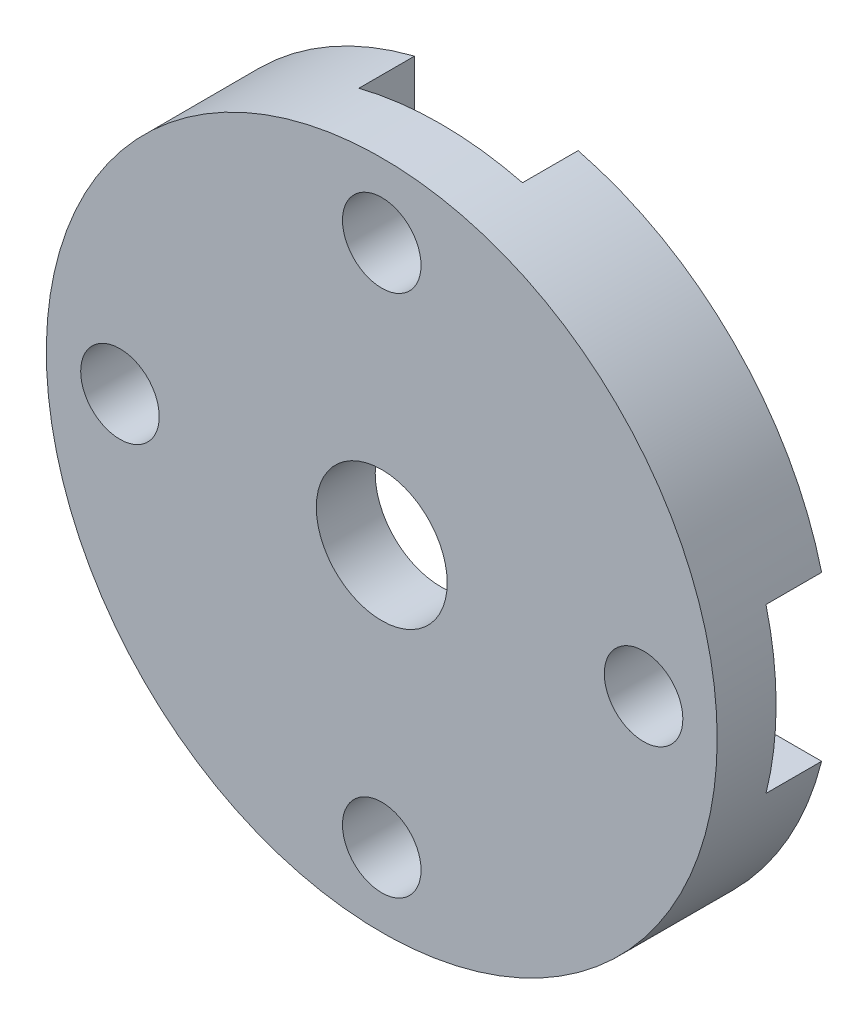
ISO-10303-21;
HEADER;
FILE_DESCRIPTION(('STEP AP214'),'2;1');
FILE_NAME('part.step','',(''),(''),'','','');
FILE_SCHEMA(('AUTOMOTIVE_DESIGN { 1 0 10303 214 1 1 1 1 }'));
ENDSEC;
DATA;
#1=APPLICATION_CONTEXT('core data for automotive mechanical design processes');
#2=APPLICATION_PROTOCOL_DEFINITION('international standard','automotive_design',2000,#1);
#3=PRODUCT_CONTEXT('',#1,'mechanical');
#4=PRODUCT('Part','Part','',(#3));
#5=PRODUCT_RELATED_PRODUCT_CATEGORY('part','',(#4));
#6=PRODUCT_DEFINITION_FORMATION('','',#4);
#7=PRODUCT_DEFINITION_CONTEXT('part definition',#1,'design');
#8=PRODUCT_DEFINITION('design','',#6,#7);
#9=PRODUCT_DEFINITION_SHAPE('','',#8);
#10=(LENGTH_UNIT() NAMED_UNIT(*) SI_UNIT(.MILLI.,.METRE.));
#11=(NAMED_UNIT(*) PLANE_ANGLE_UNIT() SI_UNIT($,.RADIAN.));
#12=(NAMED_UNIT(*) SI_UNIT($,.STERADIAN.) SOLID_ANGLE_UNIT());
#13=UNCERTAINTY_MEASURE_WITH_UNIT(LENGTH_MEASURE(1.E-05),#10,'distance_accuracy_value','');
#14=(GEOMETRIC_REPRESENTATION_CONTEXT(3) GLOBAL_UNCERTAINTY_ASSIGNED_CONTEXT((#13)) GLOBAL_UNIT_ASSIGNED_CONTEXT((#10,
#11,#12)) REPRESENTATION_CONTEXT('',''));
#15=CARTESIAN_POINT('',(0.,0.,0.));
#16=DIRECTION('',(0.,0.,1.));
#17=DIRECTION('',(1.,0.,0.));
#18=AXIS2_PLACEMENT_3D('',#15,#16,#17);
#19=CARTESIAN_POINT('',(0.,0.,0.));
#20=DIRECTION('',(0.,0.,1.));
#21=DIRECTION('',(1.,0.,0.));
#22=AXIS2_PLACEMENT_3D('',#19,#20,#21);
#23=PLANE('',#22);
#24=CARTESIAN_POINT('',(7.999,-0.000999999999916204,0.));
#25=DIRECTION('',(0.,0.,-1.));
#26=DIRECTION('',(-1.,0.,0.));
#27=AXIS2_PLACEMENT_3D('',#24,#25,#26);
#28=CIRCLE('',#27,2.5);
#29=CARTESIAN_POINT('',(8.00099999935998,2.49899920000043,0.));
#30=VERTEX_POINT('',#29);
#31=CARTESIAN_POINT('',(7.60963489096445,2.46849282482581,0.));
#32=VERTEX_POINT('',#31);
#33=EDGE_CURVE('E414',#30,#32,#28,.F.);
#34=ORIENTED_EDGE('',*,*,#33,.T.);
#35=CARTESIAN_POINT('',(0.,0.,0.));
#36=DIRECTION('',(0.,0.,-1.));
#37=DIRECTION('',(-1.,0.,0.));
#38=AXIS2_PLACEMENT_3D('',#35,#36,#37);
#39=CIRCLE('',#38,8.);
#40=CARTESIAN_POINT('',(2.46929384832486,7.609375,0.));
#41=VERTEX_POINT('',#40);
#42=EDGE_CURVE('E597',#41,#32,#39,.T.);
#43=ORIENTED_EDGE('',*,*,#42,.F.);
#44=CARTESIAN_POINT('',(0.,8.,0.));
#45=DIRECTION('',(0.,0.,-1.));
#46=DIRECTION('',(-1.,0.,0.));
#47=AXIS2_PLACEMENT_3D('',#44,#45,#46);
#48=CIRCLE('',#47,2.5);
#49=CARTESIAN_POINT('',(2.5,8.,0.));
#50=VERTEX_POINT('',#49);
#51=EDGE_CURVE('E430',#41,#50,#48,.F.);
#52=ORIENTED_EDGE('',*,*,#51,.T.);
#53=DIRECTION('',(0.,1.,0.));
#54=VECTOR('',#53,1.);
#55=CARTESIAN_POINT('',(2.5,0.,0.));
#56=LINE('',#55,#54);
#57=CARTESIAN_POINT('',(2.5,9.94044767603552,0.));
#58=VERTEX_POINT('',#57);
#59=EDGE_CURVE('E431',#58,#50,#56,.F.);
#60=ORIENTED_EDGE('',*,*,#59,.F.);
#61=CARTESIAN_POINT('',(0.,0.,0.));
#62=DIRECTION('',(0.,0.,1.));
#63=DIRECTION('',(1.,0.,0.));
#64=AXIS2_PLACEMENT_3D('',#61,#62,#63);
#65=CIRCLE('',#64,10.25);
#66=CARTESIAN_POINT('',(9.94069932139573,2.49899920000038,0.));
#67=VERTEX_POINT('',#66);
#68=EDGE_CURVE('E388',#67,#58,#65,.T.);
#69=ORIENTED_EDGE('',*,*,#68,.F.);
#70=DIRECTION('',(1.,0.,0.));
#71=VECTOR('',#70,1.);
#72=CARTESIAN_POINT('',(0.,2.49899920000038,0.));
#73=LINE('',#72,#71);
#74=EDGE_CURVE('E418',#67,#30,#73,.F.);
#75=ORIENTED_EDGE('',*,*,#74,.T.);
#76=EDGE_LOOP('',(#34,#43,#52,#60,#69,#75));
#77=FACE_BOUND('',#76,.T.);
#78=ADVANCED_FACE('F47',(#77),#23,.F.);
#79=CARTESIAN_POINT('',(-2.5,8.,0.));
#80=VERTEX_POINT('',#79);
#81=CARTESIAN_POINT('',(-2.46929384832486,7.609375,0.));
#82=VERTEX_POINT('',#81);
#83=EDGE_CURVE('E435',#80,#82,#48,.F.);
#84=ORIENTED_EDGE('',*,*,#83,.T.);
#85=CARTESIAN_POINT('',(-7.60911522381814,2.47009423112945,0.));
#86=VERTEX_POINT('',#85);
#87=EDGE_CURVE('E569',#86,#82,#39,.T.);
#88=ORIENTED_EDGE('',*,*,#87,.F.);
#89=CARTESIAN_POINT('',(-8.001,0.000999999999972068,0.));
#90=DIRECTION('',(0.,0.,-1.));
#91=DIRECTION('',(-1.,0.,0.));
#92=AXIS2_PLACEMENT_3D('',#89,#90,#91);
#93=CIRCLE('',#92,2.5);
#94=CARTESIAN_POINT('',(-8.001,2.50099999999997,0.));
#95=VERTEX_POINT('',#94);
#96=EDGE_CURVE('E240',#86,#95,#93,.F.);
#97=ORIENTED_EDGE('',*,*,#96,.T.);
#98=DIRECTION('',(1.,0.,0.));
#99=VECTOR('',#98,1.);
#100=CARTESIAN_POINT('',(0.,2.50099999999997,0.));
#101=LINE('',#100,#99);
#102=CARTESIAN_POINT('',(-9.94019612482571,2.50099999999997,0.));
#103=VERTEX_POINT('',#102);
#104=EDGE_CURVE('E447',#103,#95,#101,.T.);
#105=ORIENTED_EDGE('',*,*,#104,.F.);
#106=CARTESIAN_POINT('',(-2.5,9.94044767603552,0.));
#107=VERTEX_POINT('',#106);
#108=EDGE_CURVE('E412',#107,#103,#65,.T.);
#109=ORIENTED_EDGE('',*,*,#108,.F.);
#110=DIRECTION('',(0.,1.,0.));
#111=VECTOR('',#110,1.);
#112=CARTESIAN_POINT('',(-2.5,0.,0.));
#113=LINE('',#112,#111);
#114=EDGE_CURVE('E426',#107,#80,#113,.F.);
#115=ORIENTED_EDGE('',*,*,#114,.T.);
#116=EDGE_LOOP('',(#84,#88,#97,#105,#109,#115));
#117=FACE_BOUND('',#116,.T.);
#118=ADVANCED_FACE('F520',(#117),#23,.F.);
#119=CARTESIAN_POINT('',(-8.001,-2.49900000000003,0.));
#120=VERTEX_POINT('',#119);
#121=CARTESIAN_POINT('',(-7.60973243246005,-2.46819211293725,0.));
#122=VERTEX_POINT('',#121);
#123=EDGE_CURVE('E439',#120,#122,#93,.F.);
#124=ORIENTED_EDGE('',*,*,#123,.T.);
#125=CARTESIAN_POINT('',(-2.47119607723582,-7.6087574509807,0.));
#126=VERTEX_POINT('',#125);
#127=EDGE_CURVE('E550',#126,#122,#39,.T.);
#128=ORIENTED_EDGE('',*,*,#127,.F.);
#129=CARTESIAN_POINT('',(-0.00199999999994414,-8.,0.));
#130=DIRECTION('',(0.,0.,-1.));
#131=DIRECTION('',(-1.,0.,0.));
#132=AXIS2_PLACEMENT_3D('',#129,#130,#131);
#133=CIRCLE('',#132,2.50000000000003);
#134=CARTESIAN_POINT('',(-2.50100020015988,-8.07068945608362,0.));
#135=VERTEX_POINT('',#134);
#136=EDGE_CURVE('E87',#126,#135,#133,.F.);
#137=ORIENTED_EDGE('',*,*,#136,.T.);
#138=DIRECTION('',(0.,1.,0.));
#139=VECTOR('',#138,1.);
#140=CARTESIAN_POINT('',(-2.50099999999994,0.,0.));
#141=LINE('',#140,#139);
#142=CARTESIAN_POINT('',(-2.50099999999994,-9.94019612482572,0.));
#143=VERTEX_POINT('',#142);
#144=EDGE_CURVE('E11',#143,#135,#141,.T.);
#145=ORIENTED_EDGE('',*,*,#144,.F.);
#146=CARTESIAN_POINT('',(-9.94069912028324,-2.49900000000003,0.));
#147=VERTEX_POINT('',#146);
#148=EDGE_CURVE('E413',#147,#143,#65,.T.);
#149=ORIENTED_EDGE('',*,*,#148,.F.);
#150=DIRECTION('',(1.,0.,0.));
#151=VECTOR('',#150,1.);
#152=CARTESIAN_POINT('',(0.,-2.49900000000003,0.));
#153=LINE('',#152,#151);
#154=EDGE_CURVE('E443',#147,#120,#153,.T.);
#155=ORIENTED_EDGE('',*,*,#154,.T.);
#156=EDGE_LOOP('',(#124,#128,#137,#145,#149,#155));
#157=FACE_BOUND('',#156,.T.);
#158=ADVANCED_FACE('F527',(#157),#23,.F.);
#159=CARTESIAN_POINT('',(0.,0.,3.5));
#160=DIRECTION('',(0.,0.,-1.));
#161=DIRECTION('',(-1.,0.,0.));
#162=AXIS2_PLACEMENT_3D('',#159,#160,#161);
#163=CYLINDRICAL_SURFACE('',#162,2.);
#164=CARTESIAN_POINT('',(0.,0.,3.5));
#165=DIRECTION('',(0.,0.,1.));
#166=DIRECTION('',(1.,0.,0.));
#167=AXIS2_PLACEMENT_3D('',#164,#165,#166);
#168=CIRCLE('',#167,2.);
#169=CARTESIAN_POINT('',(2.,0.,3.5));
#170=VERTEX_POINT('',#169);
#171=EDGE_CURVE('E400',#170,#170,#168,.T.);
#172=ORIENTED_EDGE('',*,*,#171,.T.);
#173=EDGE_LOOP('',(#172));
#174=FACE_BOUND('',#173,.T.);
#175=CARTESIAN_POINT('',(0.,0.,1.7));
#176=DIRECTION('',(0.,0.,-1.));
#177=DIRECTION('',(-1.,0.,0.));
#178=AXIS2_PLACEMENT_3D('',#175,#176,#177);
#179=CIRCLE('',#178,2.);
#180=CARTESIAN_POINT('',(-2.,0.,1.7));
#181=VERTEX_POINT('',#180);
#182=EDGE_CURVE('E275',#181,#181,#179,.T.);
#183=ORIENTED_EDGE('',*,*,#182,.T.);
#184=EDGE_LOOP('',(#183));
#185=FACE_BOUND('',#184,.T.);
#186=ADVANCED_FACE('F493',(#174,#185),#163,.F.);
#187=CARTESIAN_POINT('',(7.999,-0.000999999999916204,1.7));
#188=DIRECTION('',(0.,0.,-1.));
#189=DIRECTION('',(-1.,0.,0.));
#190=AXIS2_PLACEMENT_3D('',#187,#188,#189);
#191=CYLINDRICAL_SURFACE('',#190,2.5);
#192=CARTESIAN_POINT('',(7.999,-0.000999999999916204,1.7));
#193=DIRECTION('',(0.,0.,-1.));
#194=DIRECTION('',(-1.,0.,0.));
#195=AXIS2_PLACEMENT_3D('',#192,#193,#194);
#196=CIRCLE('',#195,2.5);
#197=CARTESIAN_POINT('',(7.60963489096445,2.46849282482581,1.7));
#198=VERTEX_POINT('',#197);
#199=CARTESIAN_POINT('',(8.00099999935998,2.49899920000038,1.7));
#200=VERTEX_POINT('',#199);
#201=EDGE_CURVE('E355',#198,#200,#196,.T.);
#202=ORIENTED_EDGE('',*,*,#201,.F.);
#203=DIRECTION('',(0.,0.,-1.));
#204=VECTOR('',#203,1.);
#205=CARTESIAN_POINT('',(7.60963489096445,2.46849282482581,0.85));
#206=LINE('',#205,#204);
#207=EDGE_CURVE('E486',#198,#32,#206,.T.);
#208=ORIENTED_EDGE('',*,*,#207,.T.);
#209=ORIENTED_EDGE('',*,*,#33,.F.);
#210=DIRECTION('',(0.,0.,-1.));
#211=VECTOR('',#210,1.);
#212=CARTESIAN_POINT('',(8.00099999935998,2.49899920000038,1.7));
#213=LINE('',#212,#211);
#214=EDGE_CURVE('E371',#200,#30,#213,.T.);
#215=ORIENTED_EDGE('',*,*,#214,.F.);
#216=EDGE_LOOP('',(#202,#208,#209,#215));
#217=FACE_BOUND('',#216,.T.);
#218=ADVANCED_FACE('F547',(#217),#191,.F.);
#219=CARTESIAN_POINT('',(0.,8.,1.7));
#220=DIRECTION('',(0.,0.,-1.));
#221=DIRECTION('',(-1.,0.,0.));
#222=AXIS2_PLACEMENT_3D('',#219,#220,#221);
#223=CYLINDRICAL_SURFACE('',#222,2.5);
#224=CARTESIAN_POINT('',(0.,8.,1.7));
#225=DIRECTION('',(0.,0.,-1.));
#226=DIRECTION('',(-1.,0.,0.));
#227=AXIS2_PLACEMENT_3D('',#224,#225,#226);
#228=CIRCLE('',#227,2.5);
#229=CARTESIAN_POINT('',(-2.46929384832486,7.609375,1.7));
#230=VERTEX_POINT('',#229);
#231=CARTESIAN_POINT('',(-2.5,8.,1.7));
#232=VERTEX_POINT('',#231);
#233=EDGE_CURVE('E294',#230,#232,#228,.T.);
#234=ORIENTED_EDGE('',*,*,#233,.F.);
#235=DIRECTION('',(0.,0.,-1.));
#236=VECTOR('',#235,1.);
#237=CARTESIAN_POINT('',(-2.46929384832486,7.609375,0.85));
#238=LINE('',#237,#236);
#239=EDGE_CURVE('E226',#230,#82,#238,.T.);
#240=ORIENTED_EDGE('',*,*,#239,.T.);
#241=ORIENTED_EDGE('',*,*,#83,.F.);
#242=DIRECTION('',(0.,0.,-1.));
#243=VECTOR('',#242,1.);
#244=CARTESIAN_POINT('',(-2.5,8.,1.7));
#245=LINE('',#244,#243);
#246=EDGE_CURVE('E311',#232,#80,#245,.T.);
#247=ORIENTED_EDGE('',*,*,#246,.F.);
#248=EDGE_LOOP('',(#234,#240,#241,#247));
#249=FACE_BOUND('',#248,.T.);
#250=ADVANCED_FACE('F584',(#249),#223,.F.);
#251=CARTESIAN_POINT('',(-8.001,0.000999999999972068,1.7));
#252=DIRECTION('',(0.,0.,-1.));
#253=DIRECTION('',(-1.,0.,0.));
#254=AXIS2_PLACEMENT_3D('',#251,#252,#253);
#255=CYLINDRICAL_SURFACE('',#254,2.5);
#256=CARTESIAN_POINT('',(-8.001,0.000999999999972068,1.7));
#257=DIRECTION('',(0.,0.,-1.));
#258=DIRECTION('',(-1.,0.,0.));
#259=AXIS2_PLACEMENT_3D('',#256,#257,#258);
#260=CIRCLE('',#259,2.5);
#261=CARTESIAN_POINT('',(-7.60973243246005,-2.46819211293725,1.7));
#262=VERTEX_POINT('',#261);
#263=CARTESIAN_POINT('',(-8.001,-2.49900000000003,1.7));
#264=VERTEX_POINT('',#263);
#265=EDGE_CURVE('E253',#262,#264,#260,.T.);
#266=ORIENTED_EDGE('',*,*,#265,.F.);
#267=DIRECTION('',(0.,0.,-1.));
#268=VECTOR('',#267,1.);
#269=CARTESIAN_POINT('',(-7.60973243246005,-2.46819211293725,0.85));
#270=LINE('',#269,#268);
#271=EDGE_CURVE('E242',#262,#122,#270,.T.);
#272=ORIENTED_EDGE('',*,*,#271,.T.);
#273=ORIENTED_EDGE('',*,*,#123,.F.);
#274=DIRECTION('',(0.,0.,-1.));
#275=VECTOR('',#274,1.);
#276=CARTESIAN_POINT('',(-8.001,-2.49900000000003,1.7));
#277=LINE('',#276,#275);
#278=EDGE_CURVE('E330',#264,#120,#277,.T.);
#279=ORIENTED_EDGE('',*,*,#278,.F.);
#280=EDGE_LOOP('',(#266,#272,#273,#279));
#281=FACE_BOUND('',#280,.T.);
#282=ADVANCED_FACE('F555',(#281),#255,.F.);
#283=CARTESIAN_POINT('',(-0.00199999999994414,-8.,1.7));
#284=DIRECTION('',(0.,0.,-1.));
#285=DIRECTION('',(-1.,0.,0.));
#286=AXIS2_PLACEMENT_3D('',#283,#284,#285);
#287=CYLINDRICAL_SURFACE('',#286,2.50000000000003);
#288=CARTESIAN_POINT('',(-0.00199999999994414,-8.,1.7));
#289=DIRECTION('',(0.,0.,-1.));
#290=DIRECTION('',(-1.,0.,0.));
#291=AXIS2_PLACEMENT_3D('',#288,#289,#290);
#292=CIRCLE('',#291,2.50000000000003);
#293=CARTESIAN_POINT('',(2.46739138984872,-7.60999209784744,1.7));
#294=VERTEX_POINT('',#293);
#295=CARTESIAN_POINT('',(2.49800000000006,-8.,1.7));
#296=VERTEX_POINT('',#295);
#297=EDGE_CURVE('E274',#294,#296,#292,.T.);
#298=ORIENTED_EDGE('',*,*,#297,.F.);
#299=DIRECTION('',(0.,0.,-1.));
#300=VECTOR('',#299,1.);
#301=CARTESIAN_POINT('',(2.46739138984872,-7.60999209784744,0.85));
#302=LINE('',#301,#300);
#303=CARTESIAN_POINT('',(2.46739138984872,-7.60999209784744,0.));
#304=VERTEX_POINT('',#303);
#305=EDGE_CURVE('E243',#294,#304,#302,.T.);
#306=ORIENTED_EDGE('',*,*,#305,.T.);
#307=CARTESIAN_POINT('',(2.49800000000006,-8.,0.));
#308=VERTEX_POINT('',#307);
#309=EDGE_CURVE('E51',#308,#304,#133,.F.);
#310=ORIENTED_EDGE('',*,*,#309,.F.);
#311=DIRECTION('',(0.,0.,-1.));
#312=VECTOR('',#311,1.);
#313=CARTESIAN_POINT('',(2.49800000000006,-8.,1.7));
#314=LINE('',#313,#312);
#315=EDGE_CURVE('E72',#296,#308,#314,.T.);
#316=ORIENTED_EDGE('',*,*,#315,.F.);
#317=EDGE_LOOP('',(#298,#306,#310,#316));
#318=FACE_BOUND('',#317,.T.);
#319=ADVANCED_FACE('F464',(#318),#287,.F.);
#320=CARTESIAN_POINT('',(0.,8.,3.5));
#321=DIRECTION('',(0.,0.,-1.));
#322=DIRECTION('',(-1.,0.,0.));
#323=AXIS2_PLACEMENT_3D('',#320,#321,#322);
#324=CYLINDRICAL_SURFACE('',#323,1.2);
#325=CARTESIAN_POINT('',(0.,8.,3.5));
#326=DIRECTION('',(0.,0.,1.));
#327=DIRECTION('',(1.,0.,0.));
#328=AXIS2_PLACEMENT_3D('',#325,#326,#327);
#329=CIRCLE('',#328,1.2);
#330=CARTESIAN_POINT('',(1.2,8.,3.5));
#331=VERTEX_POINT('',#330);
#332=EDGE_CURVE('E396',#331,#331,#329,.T.);
#333=ORIENTED_EDGE('',*,*,#332,.T.);
#334=EDGE_LOOP('',(#333));
#335=FACE_BOUND('',#334,.T.);
#336=CARTESIAN_POINT('',(0.,8.,1.7));
#337=DIRECTION('',(0.,0.,-1.));
#338=DIRECTION('',(-1.,0.,0.));
#339=AXIS2_PLACEMENT_3D('',#336,#337,#338);
#340=CIRCLE('',#339,1.2);
#341=CARTESIAN_POINT('',(-1.2,8.,1.7));
#342=VERTEX_POINT('',#341);
#343=EDGE_CURVE('E290',#342,#342,#340,.F.);
#344=ORIENTED_EDGE('',*,*,#343,.F.);
#345=EDGE_LOOP('',(#344));
#346=FACE_BOUND('',#345,.T.);
#347=ADVANCED_FACE('F509',(#335,#346),#324,.F.);
#348=CARTESIAN_POINT('',(8.,0.,3.5));
#349=DIRECTION('',(0.,0.,-1.));
#350=DIRECTION('',(-1.,0.,0.));
#351=AXIS2_PLACEMENT_3D('',#348,#349,#350);
#352=CYLINDRICAL_SURFACE('',#351,1.2);
#353=CARTESIAN_POINT('',(8.,0.,3.5));
#354=DIRECTION('',(0.,0.,1.));
#355=DIRECTION('',(1.,0.,0.));
#356=AXIS2_PLACEMENT_3D('',#353,#354,#355);
#357=CIRCLE('',#356,1.2);
#358=CARTESIAN_POINT('',(9.2,0.,3.5));
#359=VERTEX_POINT('',#358);
#360=EDGE_CURVE('E392',#359,#359,#357,.T.);
#361=ORIENTED_EDGE('',*,*,#360,.T.);
#362=EDGE_LOOP('',(#361));
#363=FACE_BOUND('',#362,.T.);
#364=CARTESIAN_POINT('',(8.,0.,1.7));
#365=DIRECTION('',(0.,0.,-1.));
#366=DIRECTION('',(-1.,0.,0.));
#367=AXIS2_PLACEMENT_3D('',#364,#365,#366);
#368=CIRCLE('',#367,1.2);
#369=CARTESIAN_POINT('',(6.8,0.,1.7));
#370=VERTEX_POINT('',#369);
#371=EDGE_CURVE('E316',#370,#370,#368,.F.);
#372=ORIENTED_EDGE('',*,*,#371,.F.);
#373=EDGE_LOOP('',(#372));
#374=FACE_BOUND('',#373,.T.);
#375=ADVANCED_FACE('F506',(#363,#374),#352,.F.);
#376=CARTESIAN_POINT('',(0.,-8.,3.5));
#377=DIRECTION('',(0.,0.,-1.));
#378=DIRECTION('',(-1.,0.,0.));
#379=AXIS2_PLACEMENT_3D('',#376,#377,#378);
#380=CYLINDRICAL_SURFACE('',#379,1.2);
#381=CARTESIAN_POINT('',(0.,-8.,3.5));
#382=DIRECTION('',(0.,0.,1.));
#383=DIRECTION('',(1.,0.,0.));
#384=AXIS2_PLACEMENT_3D('',#381,#382,#383);
#385=CIRCLE('',#384,1.2);
#386=CARTESIAN_POINT('',(1.19999999999994,-8.,3.5));
#387=VERTEX_POINT('',#386);
#388=EDGE_CURVE('E387',#387,#387,#385,.T.);
#389=ORIENTED_EDGE('',*,*,#388,.T.);
#390=EDGE_LOOP('',(#389));
#391=FACE_BOUND('',#390,.T.);
#392=CARTESIAN_POINT('',(0.,-8.,1.7));
#393=DIRECTION('',(0.,0.,-1.));
#394=DIRECTION('',(-1.,0.,0.));
#395=AXIS2_PLACEMENT_3D('',#392,#393,#394);
#396=CIRCLE('',#395,1.2);
#397=CARTESIAN_POINT('',(-1.20000000000006,-8.,1.7));
#398=VERTEX_POINT('',#397);
#399=EDGE_CURVE('E270',#398,#398,#396,.F.);
#400=ORIENTED_EDGE('',*,*,#399,.F.);
#401=EDGE_LOOP('',(#400));
#402=FACE_BOUND('',#401,.T.);
#403=ADVANCED_FACE('F508',(#391,#402),#380,.F.);
#404=CARTESIAN_POINT('',(-8.,0.,3.5));
#405=DIRECTION('',(0.,0.,-1.));
#406=DIRECTION('',(-1.,0.,0.));
#407=AXIS2_PLACEMENT_3D('',#404,#405,#406);
#408=CYLINDRICAL_SURFACE('',#407,1.2);
#409=CARTESIAN_POINT('',(-8.,0.,3.5));
#410=DIRECTION('',(0.,0.,1.));
#411=DIRECTION('',(1.,0.,0.));
#412=AXIS2_PLACEMENT_3D('',#409,#410,#411);
#413=CIRCLE('',#412,1.2);
#414=CARTESIAN_POINT('',(-6.8,0.,3.5));
#415=VERTEX_POINT('',#414);
#416=EDGE_CURVE('E383',#415,#415,#413,.T.);
#417=ORIENTED_EDGE('',*,*,#416,.T.);
#418=EDGE_LOOP('',(#417));
#419=FACE_BOUND('',#418,.T.);
#420=CARTESIAN_POINT('',(-8.,0.,1.7));
#421=DIRECTION('',(0.,0.,-1.));
#422=DIRECTION('',(-1.,0.,0.));
#423=AXIS2_PLACEMENT_3D('',#420,#421,#422);
#424=CIRCLE('',#423,1.2);
#425=CARTESIAN_POINT('',(-9.2,0.,1.7));
#426=VERTEX_POINT('',#425);
#427=EDGE_CURVE('E265',#426,#426,#424,.F.);
#428=ORIENTED_EDGE('',*,*,#427,.F.);
#429=EDGE_LOOP('',(#428));
#430=FACE_BOUND('',#429,.T.);
#431=ADVANCED_FACE('F49',(#419,#430),#408,.F.);
#432=CARTESIAN_POINT('',(0.,0.,3.5));
#433=DIRECTION('',(0.,0.,-1.));
#434=DIRECTION('',(-1.,0.,0.));
#435=AXIS2_PLACEMENT_3D('',#432,#433,#434);
#436=CYLINDRICAL_SURFACE('',#435,10.25);
#437=CARTESIAN_POINT('',(0.,0.,3.5));
#438=DIRECTION('',(0.,0.,1.));
#439=DIRECTION('',(1.,0.,0.));
#440=AXIS2_PLACEMENT_3D('',#437,#438,#439);
#441=CIRCLE('',#440,10.25);
#442=CARTESIAN_POINT('',(10.25,0.,3.5));
#443=VERTEX_POINT('',#442);
#444=EDGE_CURVE('E404',#443,#443,#441,.T.);
#445=ORIENTED_EDGE('',*,*,#444,.F.);
#446=EDGE_LOOP('',(#445));
#447=FACE_BOUND('',#446,.T.);
#448=DIRECTION('',(0.,0.,-1.));
#449=VECTOR('',#448,1.);
#450=CARTESIAN_POINT('',(-2.50099999999994,-9.94019612482572,1.7));
#451=LINE('',#450,#449);
#452=CARTESIAN_POINT('',(-2.50099999999994,-9.94019612482572,1.7));
#453=VERTEX_POINT('',#452);
#454=EDGE_CURVE('E95',#453,#143,#451,.T.);
#455=ORIENTED_EDGE('',*,*,#454,.F.);
#456=CARTESIAN_POINT('',(0.,0.,1.7));
#457=DIRECTION('',(0.,0.,-1.));
#458=DIRECTION('',(-1.,0.,0.));
#459=AXIS2_PLACEMENT_3D('',#456,#457,#458);
#460=CIRCLE('',#459,10.25);
#461=CARTESIAN_POINT('',(2.49800000000006,-9.94095045757697,1.7));
#462=VERTEX_POINT('',#461);
#463=EDGE_CURVE('E283',#462,#453,#460,.T.);
#464=ORIENTED_EDGE('',*,*,#463,.F.);
#465=DIRECTION('',(0.,0.,-1.));
#466=VECTOR('',#465,1.);
#467=CARTESIAN_POINT('',(2.49800000000006,-9.94095045757697,1.7));
#468=LINE('',#467,#466);
#469=CARTESIAN_POINT('',(2.49800000000006,-9.94095045757697,0.));
#470=VERTEX_POINT('',#469);
#471=EDGE_CURVE('E344',#462,#470,#468,.T.);
#472=ORIENTED_EDGE('',*,*,#471,.T.);
#473=CARTESIAN_POINT('',(9.94069912028324,-2.49900000000003,0.));
#474=VERTEX_POINT('',#473);
#475=EDGE_CURVE('E382',#470,#474,#65,.T.);
#476=ORIENTED_EDGE('',*,*,#475,.T.);
#477=DIRECTION('',(0.,0.,-1.));
#478=VECTOR('',#477,1.);
#479=CARTESIAN_POINT('',(9.94069912028324,-2.49900000000003,1.7));
#480=LINE('',#479,#478);
#481=CARTESIAN_POINT('',(9.94069912028324,-2.49900000000003,1.7));
#482=VERTEX_POINT('',#481);
#483=EDGE_CURVE('E379',#482,#474,#480,.T.);
#484=ORIENTED_EDGE('',*,*,#483,.F.);
#485=CARTESIAN_POINT('',(0.,0.,1.7));
#486=DIRECTION('',(0.,0.,-1.));
#487=DIRECTION('',(-1.,0.,0.));
#488=AXIS2_PLACEMENT_3D('',#485,#486,#487);
#489=CIRCLE('',#488,10.25);
#490=CARTESIAN_POINT('',(9.94069932139572,2.49899920000038,1.7));
#491=VERTEX_POINT('',#490);
#492=EDGE_CURVE('E363',#491,#482,#489,.T.);
#493=ORIENTED_EDGE('',*,*,#492,.F.);
#494=DIRECTION('',(0.,0.,-1.));
#495=VECTOR('',#494,1.);
#496=CARTESIAN_POINT('',(9.94069932139572,2.49899920000038,1.7));
#497=LINE('',#496,#495);
#498=EDGE_CURVE('E375',#491,#67,#497,.T.);
#499=ORIENTED_EDGE('',*,*,#498,.T.);
#500=ORIENTED_EDGE('',*,*,#68,.T.);
#501=DIRECTION('',(0.,0.,-1.));
#502=VECTOR('',#501,1.);
#503=CARTESIAN_POINT('',(2.5,9.94044767603552,1.7));
#504=LINE('',#503,#502);
#505=CARTESIAN_POINT('',(2.5,9.94044767603552,1.7));
#506=VERTEX_POINT('',#505);
#507=EDGE_CURVE('E317',#506,#58,#504,.T.);
#508=ORIENTED_EDGE('',*,*,#507,.F.);
#509=CARTESIAN_POINT('',(0.,0.,1.7));
#510=DIRECTION('',(0.,0.,-1.));
#511=DIRECTION('',(-1.,0.,0.));
#512=AXIS2_PLACEMENT_3D('',#509,#510,#511);
#513=CIRCLE('',#512,10.25);
#514=CARTESIAN_POINT('',(-2.5,9.94044767603552,1.7));
#515=VERTEX_POINT('',#514);
#516=EDGE_CURVE('E304',#515,#506,#513,.T.);
#517=ORIENTED_EDGE('',*,*,#516,.F.);
#518=DIRECTION('',(0.,0.,-1.));
#519=VECTOR('',#518,1.);
#520=CARTESIAN_POINT('',(-2.5,9.94044767603552,1.7));
#521=LINE('',#520,#519);
#522=EDGE_CURVE('E320',#515,#107,#521,.T.);
#523=ORIENTED_EDGE('',*,*,#522,.T.);
#524=ORIENTED_EDGE('',*,*,#108,.T.);
#525=DIRECTION('',(0.,0.,-1.));
#526=VECTOR('',#525,1.);
#527=CARTESIAN_POINT('',(-9.94019612482571,2.50099999999997,1.7));
#528=LINE('',#527,#526);
#529=CARTESIAN_POINT('',(-9.94019612482571,2.50099999999997,1.7));
#530=VERTEX_POINT('',#529);
#531=EDGE_CURVE('E295',#530,#103,#528,.T.);
#532=ORIENTED_EDGE('',*,*,#531,.F.);
#533=CARTESIAN_POINT('',(0.,0.,1.7));
#534=DIRECTION('',(0.,0.,-1.));
#535=DIRECTION('',(-1.,0.,0.));
#536=AXIS2_PLACEMENT_3D('',#533,#534,#535);
#537=CIRCLE('',#536,10.25);
#538=CARTESIAN_POINT('',(-9.94069912028324,-2.49900000000003,1.7));
#539=VERTEX_POINT('',#538);
#540=EDGE_CURVE('E258',#539,#530,#537,.T.);
#541=ORIENTED_EDGE('',*,*,#540,.F.);
#542=DIRECTION('',(0.,0.,-1.));
#543=VECTOR('',#542,1.);
#544=CARTESIAN_POINT('',(-9.94069912028324,-2.49900000000003,1.7));
#545=LINE('',#544,#543);
#546=EDGE_CURVE('E326',#539,#147,#545,.T.);
#547=ORIENTED_EDGE('',*,*,#546,.T.);
#548=ORIENTED_EDGE('',*,*,#148,.T.);
#549=EDGE_LOOP('',(#455,#464,#472,#476,#484,#493,#499,#500,#508,#517,#523,#524,#532,#541,#547,#548));
#550=FACE_BOUND('',#549,.T.);
#551=ADVANCED_FACE('F533',(#447,#550),#436,.T.);
#552=ORIENTED_EDGE('',*,*,#309,.T.);
#553=CARTESIAN_POINT('',(7.60901745275735,-2.47039539418978,0.));
#554=VERTEX_POINT('',#553);
#555=EDGE_CURVE('E459',#554,#304,#39,.T.);
#556=ORIENTED_EDGE('',*,*,#555,.F.);
#557=CARTESIAN_POINT('',(8.09897999799685,-2.49900000000003,0.));
#558=VERTEX_POINT('',#557);
#559=EDGE_CURVE('E408',#554,#558,#28,.F.);
#560=ORIENTED_EDGE('',*,*,#559,.T.);
#561=DIRECTION('',(1.,0.,0.));
#562=VECTOR('',#561,1.);
#563=CARTESIAN_POINT('',(0.,-2.49900000000003,0.));
#564=LINE('',#563,#562);
#565=EDGE_CURVE('E422',#474,#558,#564,.F.);
#566=ORIENTED_EDGE('',*,*,#565,.F.);
#567=ORIENTED_EDGE('',*,*,#475,.F.);
#568=DIRECTION('',(0.,1.,0.));
#569=VECTOR('',#568,1.);
#570=CARTESIAN_POINT('',(2.49800000000006,0.,0.));
#571=LINE('',#570,#569);
#572=EDGE_CURVE('E99',#470,#308,#571,.T.);
#573=ORIENTED_EDGE('',*,*,#572,.T.);
#574=EDGE_LOOP('',(#552,#556,#560,#566,#567,#573));
#575=FACE_BOUND('',#574,.T.);
#576=ADVANCED_FACE('F458',(#575),#23,.F.);
#577=CARTESIAN_POINT('',(0.,0.,3.5));
#578=DIRECTION('',(0.,0.,1.));
#579=DIRECTION('',(1.,0.,0.));
#580=AXIS2_PLACEMENT_3D('',#577,#578,#579);
#581=PLANE('',#580);
#582=ORIENTED_EDGE('',*,*,#416,.F.);
#583=EDGE_LOOP('',(#582));
#584=FACE_BOUND('',#583,.T.);
#585=ORIENTED_EDGE('',*,*,#388,.F.);
#586=EDGE_LOOP('',(#585));
#587=FACE_BOUND('',#586,.T.);
#588=ORIENTED_EDGE('',*,*,#360,.F.);
#589=EDGE_LOOP('',(#588));
#590=FACE_BOUND('',#589,.T.);
#591=ORIENTED_EDGE('',*,*,#332,.F.);
#592=EDGE_LOOP('',(#591));
#593=FACE_BOUND('',#592,.T.);
#594=ORIENTED_EDGE('',*,*,#171,.F.);
#595=EDGE_LOOP('',(#594));
#596=FACE_BOUND('',#595,.T.);
#597=ORIENTED_EDGE('',*,*,#444,.T.);
#598=EDGE_LOOP('',(#597));
#599=FACE_BOUND('',#598,.T.);
#600=ADVANCED_FACE('F532',(#584,#587,#590,#593,#596,#599),#581,.T.);
#601=CARTESIAN_POINT('',(0.,-2.49900000000003,1.7));
#602=DIRECTION('',(0.,1.,0.));
#603=DIRECTION('',(0.,0.,1.));
#604=AXIS2_PLACEMENT_3D('',#601,#602,#603);
#605=PLANE('',#604);
#606=ORIENTED_EDGE('',*,*,#565,.T.);
#607=DIRECTION('',(0.,0.,-1.));
#608=VECTOR('',#607,1.);
#609=CARTESIAN_POINT('',(8.09897999799685,-2.49900000000003,1.7));
#610=LINE('',#609,#608);
#611=CARTESIAN_POINT('',(8.09897999799685,-2.49900000000003,1.7));
#612=VERTEX_POINT('',#611);
#613=EDGE_CURVE('E367',#612,#558,#610,.T.);
#614=ORIENTED_EDGE('',*,*,#613,.F.);
#615=DIRECTION('',(1.,0.,0.));
#616=VECTOR('',#615,1.);
#617=CARTESIAN_POINT('',(0.,-2.49900000000003,1.7));
#618=LINE('',#617,#616);
#619=EDGE_CURVE('E352',#612,#482,#618,.T.);
#620=ORIENTED_EDGE('',*,*,#619,.T.);
#621=ORIENTED_EDGE('',*,*,#483,.T.);
#622=EDGE_LOOP('',(#606,#614,#620,#621));
#623=FACE_BOUND('',#622,.T.);
#624=ADVANCED_FACE('F539',(#623),#605,.T.);
#625=CARTESIAN_POINT('',(0.,2.49899920000039,1.7));
#626=DIRECTION('',(0.,1.,0.));
#627=DIRECTION('',(-1.,0.,0.));
#628=AXIS2_PLACEMENT_3D('',#625,#626,#627);
#629=PLANE('',#628);
#630=ORIENTED_EDGE('',*,*,#498,.F.);
#631=DIRECTION('',(1.,0.,0.));
#632=VECTOR('',#631,1.);
#633=CARTESIAN_POINT('',(0.,2.49899920000039,1.7));
#634=LINE('',#633,#632);
#635=EDGE_CURVE('E359',#200,#491,#634,.T.);
#636=ORIENTED_EDGE('',*,*,#635,.F.);
#637=ORIENTED_EDGE('',*,*,#214,.T.);
#638=ORIENTED_EDGE('',*,*,#74,.F.);
#639=EDGE_LOOP('',(#630,#636,#637,#638));
#640=FACE_BOUND('',#639,.T.);
#641=ADVANCED_FACE('F610',(#640),#629,.F.);
#642=ORIENTED_EDGE('',*,*,#559,.F.);
#643=DIRECTION('',(0.,0.,-1.));
#644=VECTOR('',#643,1.);
#645=CARTESIAN_POINT('',(7.60901745275735,-2.47039539418978,0.85));
#646=LINE('',#645,#644);
#647=CARTESIAN_POINT('',(7.60901745275735,-2.47039539418978,1.7));
#648=VERTEX_POINT('',#647);
#649=EDGE_CURVE('E482',#554,#648,#646,.F.);
#650=ORIENTED_EDGE('',*,*,#649,.T.);
#651=EDGE_CURVE('E356',#612,#648,#196,.T.);
#652=ORIENTED_EDGE('',*,*,#651,.F.);
#653=ORIENTED_EDGE('',*,*,#613,.T.);
#654=EDGE_LOOP('',(#642,#650,#652,#653));
#655=FACE_BOUND('',#654,.T.);
#656=ADVANCED_FACE('F619',(#655),#191,.F.);
#657=ORIENTED_EDGE('',*,*,#51,.F.);
#658=DIRECTION('',(0.,0.,-1.));
#659=VECTOR('',#658,1.);
#660=CARTESIAN_POINT('',(2.46929384832486,7.609375,0.85));
#661=LINE('',#660,#659);
#662=CARTESIAN_POINT('',(2.46929384832486,7.609375,1.7));
#663=VERTEX_POINT('',#662);
#664=EDGE_CURVE('E476',#41,#663,#661,.F.);
#665=ORIENTED_EDGE('',*,*,#664,.T.);
#666=CARTESIAN_POINT('',(2.5,8.,1.7));
#667=VERTEX_POINT('',#666);
#668=EDGE_CURVE('E296',#667,#663,#228,.T.);
#669=ORIENTED_EDGE('',*,*,#668,.F.);
#670=DIRECTION('',(0.,0.,-1.));
#671=VECTOR('',#670,1.);
#672=CARTESIAN_POINT('',(2.5,8.,1.7));
#673=LINE('',#672,#671);
#674=EDGE_CURVE('E312',#667,#50,#673,.T.);
#675=ORIENTED_EDGE('',*,*,#674,.T.);
#676=EDGE_LOOP('',(#657,#665,#669,#675));
#677=FACE_BOUND('',#676,.T.);
#678=ADVANCED_FACE('F594',(#677),#223,.F.);
#679=CARTESIAN_POINT('',(2.5,0.,1.7));
#680=DIRECTION('',(-1.,0.,0.));
#681=DIRECTION('',(0.,0.,1.));
#682=AXIS2_PLACEMENT_3D('',#679,#680,#681);
#683=PLANE('',#682);
#684=ORIENTED_EDGE('',*,*,#59,.T.);
#685=ORIENTED_EDGE('',*,*,#674,.F.);
#686=DIRECTION('',(0.,1.,0.));
#687=VECTOR('',#686,1.);
#688=CARTESIAN_POINT('',(2.5,0.,1.7));
#689=LINE('',#688,#687);
#690=EDGE_CURVE('E308',#667,#506,#689,.T.);
#691=ORIENTED_EDGE('',*,*,#690,.T.);
#692=ORIENTED_EDGE('',*,*,#507,.T.);
#693=EDGE_LOOP('',(#684,#685,#691,#692));
#694=FACE_BOUND('',#693,.T.);
#695=ADVANCED_FACE('F643',(#694),#683,.T.);
#696=CARTESIAN_POINT('',(-2.5,0.,1.7));
#697=DIRECTION('',(-1.,0.,0.));
#698=DIRECTION('',(0.,0.,1.));
#699=AXIS2_PLACEMENT_3D('',#696,#697,#698);
#700=PLANE('',#699);
#701=ORIENTED_EDGE('',*,*,#522,.F.);
#702=DIRECTION('',(0.,1.,0.));
#703=VECTOR('',#702,1.);
#704=CARTESIAN_POINT('',(-2.5,0.,1.7));
#705=LINE('',#704,#703);
#706=EDGE_CURVE('E300',#232,#515,#705,.T.);
#707=ORIENTED_EDGE('',*,*,#706,.F.);
#708=ORIENTED_EDGE('',*,*,#246,.T.);
#709=ORIENTED_EDGE('',*,*,#114,.F.);
#710=EDGE_LOOP('',(#701,#707,#708,#709));
#711=FACE_BOUND('',#710,.T.);
#712=ADVANCED_FACE('F586',(#711),#700,.F.);
#713=CARTESIAN_POINT('',(0.,2.50099999999997,1.7));
#714=DIRECTION('',(0.,-1.,0.));
#715=DIRECTION('',(0.,0.,-1.));
#716=AXIS2_PLACEMENT_3D('',#713,#714,#715);
#717=PLANE('',#716);
#718=ORIENTED_EDGE('',*,*,#104,.T.);
#719=DIRECTION('',(0.,0.,-1.));
#720=VECTOR('',#719,1.);
#721=CARTESIAN_POINT('',(-8.001,2.50099999999997,1.7));
#722=LINE('',#721,#720);
#723=CARTESIAN_POINT('',(-8.001,2.50099999999997,1.7));
#724=VERTEX_POINT('',#723);
#725=EDGE_CURVE('E269',#724,#95,#722,.T.);
#726=ORIENTED_EDGE('',*,*,#725,.F.);
#727=DIRECTION('',(-1.,0.,0.));
#728=VECTOR('',#727,1.);
#729=CARTESIAN_POINT('',(0.,2.50099999999997,1.7));
#730=LINE('',#729,#728);
#731=EDGE_CURVE('E250',#724,#530,#730,.T.);
#732=ORIENTED_EDGE('',*,*,#731,.T.);
#733=ORIENTED_EDGE('',*,*,#531,.T.);
#734=EDGE_LOOP('',(#718,#726,#732,#733));
#735=FACE_BOUND('',#734,.T.);
#736=ADVANCED_FACE('F568',(#735),#717,.T.);
#737=CARTESIAN_POINT('',(0.,-2.49900000000003,1.7));
#738=DIRECTION('',(0.,-1.,0.));
#739=DIRECTION('',(0.,0.,-1.));
#740=AXIS2_PLACEMENT_3D('',#737,#738,#739);
#741=PLANE('',#740);
#742=ORIENTED_EDGE('',*,*,#546,.F.);
#743=DIRECTION('',(-1.,0.,0.));
#744=VECTOR('',#743,1.);
#745=CARTESIAN_POINT('',(0.,-2.49900000000003,1.7));
#746=LINE('',#745,#744);
#747=EDGE_CURVE('E252',#264,#539,#746,.T.);
#748=ORIENTED_EDGE('',*,*,#747,.F.);
#749=ORIENTED_EDGE('',*,*,#278,.T.);
#750=ORIENTED_EDGE('',*,*,#154,.F.);
#751=EDGE_LOOP('',(#742,#748,#749,#750));
#752=FACE_BOUND('',#751,.T.);
#753=ADVANCED_FACE('F558',(#752),#741,.F.);
#754=ORIENTED_EDGE('',*,*,#96,.F.);
#755=DIRECTION('',(0.,0.,-1.));
#756=VECTOR('',#755,1.);
#757=CARTESIAN_POINT('',(-7.60911522381814,2.47009423112946,0.85));
#758=LINE('',#757,#756);
#759=CARTESIAN_POINT('',(-7.60911522381814,2.47009423112946,1.7));
#760=VERTEX_POINT('',#759);
#761=EDGE_CURVE('E223',#86,#760,#758,.F.);
#762=ORIENTED_EDGE('',*,*,#761,.T.);
#763=EDGE_CURVE('E239',#724,#760,#260,.T.);
#764=ORIENTED_EDGE('',*,*,#763,.F.);
#765=ORIENTED_EDGE('',*,*,#725,.T.);
#766=EDGE_LOOP('',(#754,#762,#764,#765));
#767=FACE_BOUND('',#766,.T.);
#768=ADVANCED_FACE('F237',(#767),#255,.F.);
#769=ORIENTED_EDGE('',*,*,#136,.F.);
#770=DIRECTION('',(0.,0.,-1.));
#771=VECTOR('',#770,1.);
#772=CARTESIAN_POINT('',(-2.47119607723582,-7.6087574509807,0.85));
#773=LINE('',#772,#771);
#774=CARTESIAN_POINT('',(-2.47119607723582,-7.6087574509807,1.7));
#775=VERTEX_POINT('',#774);
#776=EDGE_CURVE('E230',#126,#775,#773,.F.);
#777=ORIENTED_EDGE('',*,*,#776,.T.);
#778=CARTESIAN_POINT('',(-2.50100040031982,-8.07068945608362,1.7));
#779=VERTEX_POINT('',#778);
#780=EDGE_CURVE('E276',#779,#775,#292,.T.);
#781=ORIENTED_EDGE('',*,*,#780,.F.);
#782=DIRECTION('',(0.,0.,-1.));
#783=VECTOR('',#782,1.);
#784=CARTESIAN_POINT('',(-2.50100040031982,-8.07068945608362,1.7));
#785=LINE('',#784,#783);
#786=EDGE_CURVE('E338',#779,#135,#785,.T.);
#787=ORIENTED_EDGE('',*,*,#786,.T.);
#788=EDGE_LOOP('',(#769,#777,#781,#787));
#789=FACE_BOUND('',#788,.T.);
#790=ADVANCED_FACE('F633',(#789),#287,.F.);
#791=CARTESIAN_POINT('',(-2.50099999999994,0.,1.7));
#792=DIRECTION('',(1.,0.,0.));
#793=DIRECTION('',(0.,0.,-1.));
#794=AXIS2_PLACEMENT_3D('',#791,#792,#793);
#795=PLANE('',#794);
#796=ORIENTED_EDGE('',*,*,#144,.T.);
#797=ORIENTED_EDGE('',*,*,#786,.F.);
#798=DIRECTION('',(0.,-1.,0.));
#799=VECTOR('',#798,1.);
#800=CARTESIAN_POINT('',(-2.50099999999994,0.,1.7));
#801=LINE('',#800,#799);
#802=EDGE_CURVE('E287',#779,#453,#801,.T.);
#803=ORIENTED_EDGE('',*,*,#802,.T.);
#804=ORIENTED_EDGE('',*,*,#454,.T.);
#805=EDGE_LOOP('',(#796,#797,#803,#804));
#806=FACE_BOUND('',#805,.T.);
#807=ADVANCED_FACE('F636',(#806),#795,.T.);
#808=CARTESIAN_POINT('',(2.49800000000006,0.,1.7));
#809=DIRECTION('',(1.,0.,0.));
#810=DIRECTION('',(0.,0.,-1.));
#811=AXIS2_PLACEMENT_3D('',#808,#809,#810);
#812=PLANE('',#811);
#813=ORIENTED_EDGE('',*,*,#471,.F.);
#814=DIRECTION('',(0.,-1.,0.));
#815=VECTOR('',#814,1.);
#816=CARTESIAN_POINT('',(2.49800000000006,0.,1.7));
#817=LINE('',#816,#815);
#818=EDGE_CURVE('E279',#296,#462,#817,.T.);
#819=ORIENTED_EDGE('',*,*,#818,.F.);
#820=ORIENTED_EDGE('',*,*,#315,.T.);
#821=ORIENTED_EDGE('',*,*,#572,.F.);
#822=EDGE_LOOP('',(#813,#819,#820,#821));
#823=FACE_BOUND('',#822,.T.);
#824=ADVANCED_FACE('F497',(#823),#812,.F.);
#825=CARTESIAN_POINT('',(0.,0.,1.7));
#826=DIRECTION('',(0.,0.,-1.));
#827=DIRECTION('',(-1.,0.,0.));
#828=AXIS2_PLACEMENT_3D('',#825,#826,#827);
#829=PLANE('',#828);
#830=ORIENTED_EDGE('',*,*,#399,.T.);
#831=EDGE_LOOP('',(#830));
#832=FACE_BOUND('',#831,.T.);
#833=ORIENTED_EDGE('',*,*,#780,.T.);
#834=CARTESIAN_POINT('',(0.,0.,1.7));
#835=DIRECTION('',(0.,0.,-1.));
#836=DIRECTION('',(-1.,0.,0.));
#837=AXIS2_PLACEMENT_3D('',#834,#835,#836);
#838=CIRCLE('',#837,8.);
#839=EDGE_CURVE('E233',#775,#262,#838,.T.);
#840=ORIENTED_EDGE('',*,*,#839,.T.);
#841=ORIENTED_EDGE('',*,*,#265,.T.);
#842=ORIENTED_EDGE('',*,*,#747,.T.);
#843=ORIENTED_EDGE('',*,*,#540,.T.);
#844=ORIENTED_EDGE('',*,*,#731,.F.);
#845=ORIENTED_EDGE('',*,*,#763,.T.);
#846=EDGE_CURVE('E220',#760,#230,#838,.T.);
#847=ORIENTED_EDGE('',*,*,#846,.T.);
#848=ORIENTED_EDGE('',*,*,#233,.T.);
#849=ORIENTED_EDGE('',*,*,#706,.T.);
#850=ORIENTED_EDGE('',*,*,#516,.T.);
#851=ORIENTED_EDGE('',*,*,#690,.F.);
#852=ORIENTED_EDGE('',*,*,#668,.T.);
#853=EDGE_CURVE('E231',#663,#198,#838,.T.);
#854=ORIENTED_EDGE('',*,*,#853,.T.);
#855=ORIENTED_EDGE('',*,*,#201,.T.);
#856=ORIENTED_EDGE('',*,*,#635,.T.);
#857=ORIENTED_EDGE('',*,*,#492,.T.);
#858=ORIENTED_EDGE('',*,*,#619,.F.);
#859=ORIENTED_EDGE('',*,*,#651,.T.);
#860=EDGE_CURVE('E63',#648,#294,#838,.T.);
#861=ORIENTED_EDGE('',*,*,#860,.T.);
#862=ORIENTED_EDGE('',*,*,#297,.T.);
#863=ORIENTED_EDGE('',*,*,#818,.T.);
#864=ORIENTED_EDGE('',*,*,#463,.T.);
#865=ORIENTED_EDGE('',*,*,#802,.F.);
#866=EDGE_LOOP('',(#833,#840,#841,#842,#843,#844,#845,#847,#848,#849,#850,#851,#852,#854,#855,
#856,#857,#858,#859,#861,#862,#863,#864,#865));
#867=FACE_BOUND('',#866,.T.);
#868=ORIENTED_EDGE('',*,*,#182,.F.);
#869=EDGE_LOOP('',(#868));
#870=FACE_BOUND('',#869,.T.);
#871=ORIENTED_EDGE('',*,*,#427,.T.);
#872=EDGE_LOOP('',(#871));
#873=FACE_BOUND('',#872,.T.);
#874=ORIENTED_EDGE('',*,*,#343,.T.);
#875=EDGE_LOOP('',(#874));
#876=FACE_BOUND('',#875,.T.);
#877=ORIENTED_EDGE('',*,*,#371,.T.);
#878=EDGE_LOOP('',(#877));
#879=FACE_BOUND('',#878,.T.);
#880=ADVANCED_FACE('F247',(#832,#867,#870,#873,#876,#879),#829,.T.);
#881=CARTESIAN_POINT('',(0.,0.,1.7));
#882=DIRECTION('',(0.,0.,-1.));
#883=DIRECTION('',(-1.,0.,0.));
#884=AXIS2_PLACEMENT_3D('',#881,#882,#883);
#885=CYLINDRICAL_SURFACE('',#884,8.);
#886=ORIENTED_EDGE('',*,*,#853,.F.);
#887=ORIENTED_EDGE('',*,*,#664,.F.);
#888=ORIENTED_EDGE('',*,*,#42,.T.);
#889=ORIENTED_EDGE('',*,*,#207,.F.);
#890=EDGE_LOOP('',(#886,#887,#888,#889));
#891=FACE_BOUND('',#890,.T.);
#892=ADVANCED_FACE('F496',(#891),#885,.F.);
#893=ORIENTED_EDGE('',*,*,#555,.T.);
#894=ORIENTED_EDGE('',*,*,#305,.F.);
#895=ORIENTED_EDGE('',*,*,#860,.F.);
#896=ORIENTED_EDGE('',*,*,#649,.F.);
#897=EDGE_LOOP('',(#893,#894,#895,#896));
#898=FACE_BOUND('',#897,.T.);
#899=ADVANCED_FACE('F620',(#898),#885,.F.);
#900=ORIENTED_EDGE('',*,*,#846,.F.);
#901=ORIENTED_EDGE('',*,*,#761,.F.);
#902=ORIENTED_EDGE('',*,*,#87,.T.);
#903=ORIENTED_EDGE('',*,*,#239,.F.);
#904=EDGE_LOOP('',(#900,#901,#902,#903));
#905=FACE_BOUND('',#904,.T.);
#906=ADVANCED_FACE('F222',(#905),#885,.F.);
#907=ORIENTED_EDGE('',*,*,#839,.F.);
#908=ORIENTED_EDGE('',*,*,#776,.F.);
#909=ORIENTED_EDGE('',*,*,#127,.T.);
#910=ORIENTED_EDGE('',*,*,#271,.F.);
#911=EDGE_LOOP('',(#907,#908,#909,#910));
#912=FACE_BOUND('',#911,.T.);
#913=ADVANCED_FACE('F627',(#912),#885,.F.);
#914=CLOSED_SHELL('',(#78,#118,#158,#186,#218,#250,#282,#319,#347,#375,#403,#431,#551,#576,#600,
#624,#641,#656,#678,#695,#712,#736,#753,#768,#790,#807,#824,#880,#892,#899,#906,#913));
#915=MANIFOLD_SOLID_BREP('B2',#914);
#916=ADVANCED_BREP_SHAPE_REPRESENTATION('',(#18,#915),#14);
#917=SHAPE_DEFINITION_REPRESENTATION(#9,#916);
ENDSEC;
END-ISO-10303-21;
